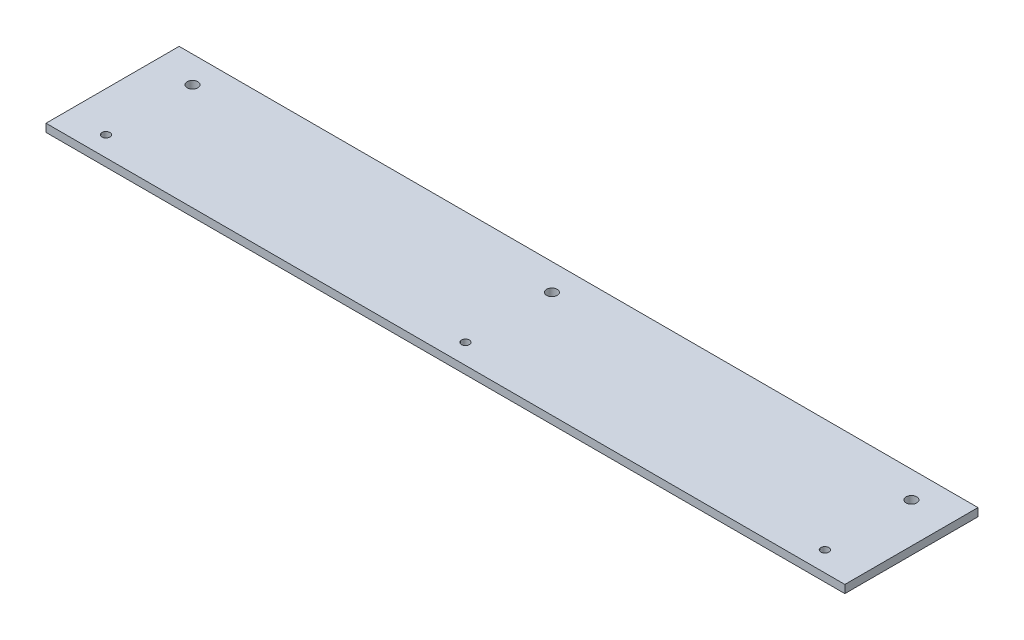
ISO-10303-21;
HEADER;
FILE_DESCRIPTION(('STEP AP214'),'2;1');
FILE_NAME('part.step','',(''),(''),'','','');
FILE_SCHEMA(('AUTOMOTIVE_DESIGN { 1 0 10303 214 1 1 1 1 }'));
ENDSEC;
DATA;
#1=APPLICATION_CONTEXT('core data for automotive mechanical design processes');
#2=APPLICATION_PROTOCOL_DEFINITION('international standard','automotive_design',2000,#1);
#3=PRODUCT_CONTEXT('',#1,'mechanical');
#4=PRODUCT('Part','Part','',(#3));
#5=PRODUCT_RELATED_PRODUCT_CATEGORY('part','',(#4));
#6=PRODUCT_DEFINITION_FORMATION('','',#4);
#7=PRODUCT_DEFINITION_CONTEXT('part definition',#1,'design');
#8=PRODUCT_DEFINITION('design','',#6,#7);
#9=PRODUCT_DEFINITION_SHAPE('','',#8);
#10=(LENGTH_UNIT() NAMED_UNIT(*) SI_UNIT(.MILLI.,.METRE.));
#11=(NAMED_UNIT(*) PLANE_ANGLE_UNIT() SI_UNIT($,.RADIAN.));
#12=(NAMED_UNIT(*) SI_UNIT($,.STERADIAN.) SOLID_ANGLE_UNIT());
#13=UNCERTAINTY_MEASURE_WITH_UNIT(LENGTH_MEASURE(1.E-05),#10,'distance_accuracy_value','');
#14=(GEOMETRIC_REPRESENTATION_CONTEXT(3) GLOBAL_UNCERTAINTY_ASSIGNED_CONTEXT((#13)) GLOBAL_UNIT_ASSIGNED_CONTEXT((#10,
#11,#12)) REPRESENTATION_CONTEXT('',''));
#15=CARTESIAN_POINT('',(0.,0.,0.));
#16=DIRECTION('',(0.,0.,1.));
#17=DIRECTION('',(1.,0.,0.));
#18=AXIS2_PLACEMENT_3D('',#15,#16,#17);
#19=CARTESIAN_POINT('',(0.,3.,0.));
#20=DIRECTION('',(0.,-1.,0.));
#21=DIRECTION('',(0.,0.,-1.));
#22=AXIS2_PLACEMENT_3D('',#19,#20,#21);
#23=PLANE('',#22);
#24=DIRECTION('',(0.,0.,1.));
#25=VECTOR('',#24,1.);
#26=CARTESIAN_POINT('',(0.,3.,0.));
#27=LINE('',#26,#25);
#28=CARTESIAN_POINT('',(0.,3.,-50.));
#29=VERTEX_POINT('',#28);
#30=CARTESIAN_POINT('',(0.,3.,0.));
#31=VERTEX_POINT('',#30);
#32=EDGE_CURVE('E96',#29,#31,#27,.T.);
#33=ORIENTED_EDGE('',*,*,#32,.T.);
#34=DIRECTION('',(1.,0.,0.));
#35=VECTOR('',#34,1.);
#36=CARTESIAN_POINT('',(0.,3.,0.));
#37=LINE('',#36,#35);
#38=CARTESIAN_POINT('',(300.,3.,0.));
#39=VERTEX_POINT('',#38);
#40=EDGE_CURVE('E91',#31,#39,#37,.T.);
#41=ORIENTED_EDGE('',*,*,#40,.T.);
#42=DIRECTION('',(0.,0.,-1.));
#43=VECTOR('',#42,1.);
#44=CARTESIAN_POINT('',(300.,3.,0.));
#45=LINE('',#44,#43);
#46=CARTESIAN_POINT('',(300.,3.,-50.));
#47=VERTEX_POINT('',#46);
#48=EDGE_CURVE('E94',#39,#47,#45,.T.);
#49=ORIENTED_EDGE('',*,*,#48,.T.);
#50=DIRECTION('',(-1.,0.,0.));
#51=VECTOR('',#50,1.);
#52=CARTESIAN_POINT('',(0.,3.,-50.));
#53=LINE('',#52,#51);
#54=EDGE_CURVE('E61',#47,#29,#53,.T.);
#55=ORIENTED_EDGE('',*,*,#54,.T.);
#56=EDGE_LOOP('',(#33,#41,#49,#55));
#57=FACE_BOUND('',#56,.T.);
#58=CARTESIAN_POINT('',(15.,3.,-40.));
#59=DIRECTION('',(0.,1.,0.));
#60=DIRECTION('',(0.,0.,1.));
#61=AXIS2_PLACEMENT_3D('',#58,#59,#60);
#62=CIRCLE('',#61,2.);
#63=CARTESIAN_POINT('',(15.,3.,-38.));
#64=VERTEX_POINT('',#63);
#65=EDGE_CURVE('E116',#64,#64,#62,.T.);
#66=ORIENTED_EDGE('',*,*,#65,.F.);
#67=EDGE_LOOP('',(#66));
#68=FACE_BOUND('',#67,.T.);
#69=CARTESIAN_POINT('',(150.,3.,-40.));
#70=DIRECTION('',(0.,1.,0.));
#71=DIRECTION('',(0.,0.,1.));
#72=AXIS2_PLACEMENT_3D('',#69,#70,#71);
#73=CIRCLE('',#72,2.);
#74=CARTESIAN_POINT('',(150.,3.,-38.));
#75=VERTEX_POINT('',#74);
#76=EDGE_CURVE('E138',#75,#75,#73,.T.);
#77=ORIENTED_EDGE('',*,*,#76,.F.);
#78=EDGE_LOOP('',(#77));
#79=FACE_BOUND('',#78,.T.);
#80=CARTESIAN_POINT('',(285.,3.,-40.));
#81=DIRECTION('',(0.,1.,0.));
#82=DIRECTION('',(0.,0.,1.));
#83=AXIS2_PLACEMENT_3D('',#80,#81,#82);
#84=CIRCLE('',#83,2.);
#85=CARTESIAN_POINT('',(285.,3.,-38.));
#86=VERTEX_POINT('',#85);
#87=EDGE_CURVE('E146',#86,#86,#84,.T.);
#88=ORIENTED_EDGE('',*,*,#87,.F.);
#89=EDGE_LOOP('',(#88));
#90=FACE_BOUND('',#89,.T.);
#91=CARTESIAN_POINT('',(15.,3.,-7.5));
#92=DIRECTION('',(0.,1.,0.));
#93=DIRECTION('',(0.,0.,1.));
#94=AXIS2_PLACEMENT_3D('',#91,#92,#93);
#95=CIRCLE('',#94,1.5);
#96=CARTESIAN_POINT('',(15.,3.,-6.));
#97=VERTEX_POINT('',#96);
#98=EDGE_CURVE('E154',#97,#97,#95,.T.);
#99=ORIENTED_EDGE('',*,*,#98,.F.);
#100=EDGE_LOOP('',(#99));
#101=FACE_BOUND('',#100,.T.);
#102=CARTESIAN_POINT('',(285.,3.,-7.5));
#103=DIRECTION('',(0.,1.,0.));
#104=DIRECTION('',(0.,0.,1.));
#105=AXIS2_PLACEMENT_3D('',#102,#103,#104);
#106=CIRCLE('',#105,1.50000000000002);
#107=CARTESIAN_POINT('',(285.,3.,-5.99999999999998));
#108=VERTEX_POINT('',#107);
#109=EDGE_CURVE('E162',#108,#108,#106,.T.);
#110=ORIENTED_EDGE('',*,*,#109,.F.);
#111=EDGE_LOOP('',(#110));
#112=FACE_BOUND('',#111,.T.);
#113=CARTESIAN_POINT('',(150.,3.,-7.5));
#114=DIRECTION('',(0.,1.,0.));
#115=DIRECTION('',(0.,0.,1.));
#116=AXIS2_PLACEMENT_3D('',#113,#114,#115);
#117=CIRCLE('',#116,1.5);
#118=CARTESIAN_POINT('',(150.,3.,-6.));
#119=VERTEX_POINT('',#118);
#120=EDGE_CURVE('E170',#119,#119,#117,.T.);
#121=ORIENTED_EDGE('',*,*,#120,.F.);
#122=EDGE_LOOP('',(#121));
#123=FACE_BOUND('',#122,.T.);
#124=ADVANCED_FACE('F43',(#57,#68,#79,#90,#101,#112,#123),#23,.F.);
#125=CARTESIAN_POINT('',(0.,0.,0.));
#126=DIRECTION('',(0.,-1.,0.));
#127=DIRECTION('',(0.,0.,-1.));
#128=AXIS2_PLACEMENT_3D('',#125,#126,#127);
#129=PLANE('',#128);
#130=CARTESIAN_POINT('',(285.,0.,-7.5));
#131=DIRECTION('',(0.,1.,0.));
#132=DIRECTION('',(0.,0.,1.));
#133=AXIS2_PLACEMENT_3D('',#130,#131,#132);
#134=CIRCLE('',#133,1.50000000000002);
#135=CARTESIAN_POINT('',(285.,0.,-5.99999999999998));
#136=VERTEX_POINT('',#135);
#137=EDGE_CURVE('E166',#136,#136,#134,.T.);
#138=ORIENTED_EDGE('',*,*,#137,.T.);
#139=EDGE_LOOP('',(#138));
#140=FACE_BOUND('',#139,.T.);
#141=CARTESIAN_POINT('',(285.,0.,-40.));
#142=DIRECTION('',(0.,1.,0.));
#143=DIRECTION('',(0.,0.,1.));
#144=AXIS2_PLACEMENT_3D('',#141,#142,#143);
#145=CIRCLE('',#144,2.);
#146=CARTESIAN_POINT('',(285.,0.,-38.));
#147=VERTEX_POINT('',#146);
#148=EDGE_CURVE('E150',#147,#147,#145,.T.);
#149=ORIENTED_EDGE('',*,*,#148,.T.);
#150=EDGE_LOOP('',(#149));
#151=FACE_BOUND('',#150,.T.);
#152=CARTESIAN_POINT('',(15.,0.,-40.));
#153=DIRECTION('',(0.,1.,0.));
#154=DIRECTION('',(0.,0.,1.));
#155=AXIS2_PLACEMENT_3D('',#152,#153,#154);
#156=CIRCLE('',#155,2.);
#157=CARTESIAN_POINT('',(15.,0.,-38.));
#158=VERTEX_POINT('',#157);
#159=EDGE_CURVE('E134',#158,#158,#156,.T.);
#160=ORIENTED_EDGE('',*,*,#159,.T.);
#161=EDGE_LOOP('',(#160));
#162=FACE_BOUND('',#161,.T.);
#163=DIRECTION('',(0.,0.,1.));
#164=VECTOR('',#163,1.);
#165=CARTESIAN_POINT('',(0.,0.,0.));
#166=LINE('',#165,#164);
#167=CARTESIAN_POINT('',(0.,0.,-50.));
#168=VERTEX_POINT('',#167);
#169=CARTESIAN_POINT('',(0.,0.,0.));
#170=VERTEX_POINT('',#169);
#171=EDGE_CURVE('E112',#168,#170,#166,.T.);
#172=ORIENTED_EDGE('',*,*,#171,.F.);
#173=DIRECTION('',(-1.,0.,0.));
#174=VECTOR('',#173,1.);
#175=CARTESIAN_POINT('',(0.,0.,-50.));
#176=LINE('',#175,#174);
#177=CARTESIAN_POINT('',(300.,0.,-50.));
#178=VERTEX_POINT('',#177);
#179=EDGE_CURVE('E84',#178,#168,#176,.T.);
#180=ORIENTED_EDGE('',*,*,#179,.F.);
#181=DIRECTION('',(0.,0.,-1.));
#182=VECTOR('',#181,1.);
#183=CARTESIAN_POINT('',(300.,0.,0.));
#184=LINE('',#183,#182);
#185=CARTESIAN_POINT('',(300.,0.,0.));
#186=VERTEX_POINT('',#185);
#187=EDGE_CURVE('E78',#186,#178,#184,.T.);
#188=ORIENTED_EDGE('',*,*,#187,.F.);
#189=DIRECTION('',(1.,0.,0.));
#190=VECTOR('',#189,1.);
#191=CARTESIAN_POINT('',(0.,0.,0.));
#192=LINE('',#191,#190);
#193=EDGE_CURVE('E101',#170,#186,#192,.T.);
#194=ORIENTED_EDGE('',*,*,#193,.F.);
#195=EDGE_LOOP('',(#172,#180,#188,#194));
#196=FACE_BOUND('',#195,.T.);
#197=CARTESIAN_POINT('',(150.,0.,-40.));
#198=DIRECTION('',(0.,1.,0.));
#199=DIRECTION('',(0.,0.,1.));
#200=AXIS2_PLACEMENT_3D('',#197,#198,#199);
#201=CIRCLE('',#200,2.);
#202=CARTESIAN_POINT('',(150.,0.,-38.));
#203=VERTEX_POINT('',#202);
#204=EDGE_CURVE('E142',#203,#203,#201,.T.);
#205=ORIENTED_EDGE('',*,*,#204,.T.);
#206=EDGE_LOOP('',(#205));
#207=FACE_BOUND('',#206,.T.);
#208=CARTESIAN_POINT('',(15.,0.,-7.5));
#209=DIRECTION('',(0.,1.,0.));
#210=DIRECTION('',(0.,0.,1.));
#211=AXIS2_PLACEMENT_3D('',#208,#209,#210);
#212=CIRCLE('',#211,1.5);
#213=CARTESIAN_POINT('',(15.,0.,-6.));
#214=VERTEX_POINT('',#213);
#215=EDGE_CURVE('E158',#214,#214,#212,.T.);
#216=ORIENTED_EDGE('',*,*,#215,.T.);
#217=EDGE_LOOP('',(#216));
#218=FACE_BOUND('',#217,.T.);
#219=CARTESIAN_POINT('',(150.,0.,-7.5));
#220=DIRECTION('',(0.,1.,0.));
#221=DIRECTION('',(0.,0.,1.));
#222=AXIS2_PLACEMENT_3D('',#219,#220,#221);
#223=CIRCLE('',#222,1.5);
#224=CARTESIAN_POINT('',(150.,0.,-6.));
#225=VERTEX_POINT('',#224);
#226=EDGE_CURVE('E174',#225,#225,#223,.T.);
#227=ORIENTED_EDGE('',*,*,#226,.T.);
#228=EDGE_LOOP('',(#227));
#229=FACE_BOUND('',#228,.T.);
#230=ADVANCED_FACE('F129',(#140,#151,#162,#196,#207,#218,#229),#129,.T.);
#231=CARTESIAN_POINT('',(0.,3.,0.));
#232=DIRECTION('',(1.,0.,0.));
#233=DIRECTION('',(0.,0.,-1.));
#234=AXIS2_PLACEMENT_3D('',#231,#232,#233);
#235=PLANE('',#234);
#236=ORIENTED_EDGE('',*,*,#171,.T.);
#237=DIRECTION('',(0.,-1.,0.));
#238=VECTOR('',#237,1.);
#239=CARTESIAN_POINT('',(0.,3.,0.));
#240=LINE('',#239,#238);
#241=EDGE_CURVE('E11',#31,#170,#240,.T.);
#242=ORIENTED_EDGE('',*,*,#241,.F.);
#243=ORIENTED_EDGE('',*,*,#32,.F.);
#244=DIRECTION('',(0.,-1.,0.));
#245=VECTOR('',#244,1.);
#246=CARTESIAN_POINT('',(0.,3.,-50.));
#247=LINE('',#246,#245);
#248=EDGE_CURVE('E108',#29,#168,#247,.T.);
#249=ORIENTED_EDGE('',*,*,#248,.T.);
#250=EDGE_LOOP('',(#236,#242,#243,#249));
#251=FACE_BOUND('',#250,.T.);
#252=ADVANCED_FACE('F45',(#251),#235,.F.);
#253=CARTESIAN_POINT('',(0.,3.,0.));
#254=DIRECTION('',(0.,0.,-1.));
#255=DIRECTION('',(-1.,0.,0.));
#256=AXIS2_PLACEMENT_3D('',#253,#254,#255);
#257=PLANE('',#256);
#258=ORIENTED_EDGE('',*,*,#193,.T.);
#259=DIRECTION('',(0.,-1.,0.));
#260=VECTOR('',#259,1.);
#261=CARTESIAN_POINT('',(300.,3.,0.));
#262=LINE('',#261,#260);
#263=EDGE_CURVE('E53',#39,#186,#262,.T.);
#264=ORIENTED_EDGE('',*,*,#263,.F.);
#265=ORIENTED_EDGE('',*,*,#40,.F.);
#266=ORIENTED_EDGE('',*,*,#241,.T.);
#267=EDGE_LOOP('',(#258,#264,#265,#266));
#268=FACE_BOUND('',#267,.T.);
#269=ADVANCED_FACE('F100',(#268),#257,.F.);
#270=CARTESIAN_POINT('',(300.,3.,0.));
#271=DIRECTION('',(-1.,0.,0.));
#272=DIRECTION('',(0.,0.,1.));
#273=AXIS2_PLACEMENT_3D('',#270,#271,#272);
#274=PLANE('',#273);
#275=ORIENTED_EDGE('',*,*,#187,.T.);
#276=DIRECTION('',(0.,-1.,0.));
#277=VECTOR('',#276,1.);
#278=CARTESIAN_POINT('',(300.,3.,-50.));
#279=LINE('',#278,#277);
#280=EDGE_CURVE('E103',#47,#178,#279,.T.);
#281=ORIENTED_EDGE('',*,*,#280,.F.);
#282=ORIENTED_EDGE('',*,*,#48,.F.);
#283=ORIENTED_EDGE('',*,*,#263,.T.);
#284=EDGE_LOOP('',(#275,#281,#282,#283));
#285=FACE_BOUND('',#284,.T.);
#286=ADVANCED_FACE('F104',(#285),#274,.F.);
#287=CARTESIAN_POINT('',(0.,3.,-50.));
#288=DIRECTION('',(0.,0.,1.));
#289=DIRECTION('',(1.,0.,0.));
#290=AXIS2_PLACEMENT_3D('',#287,#288,#289);
#291=PLANE('',#290);
#292=ORIENTED_EDGE('',*,*,#179,.T.);
#293=ORIENTED_EDGE('',*,*,#248,.F.);
#294=ORIENTED_EDGE('',*,*,#54,.F.);
#295=ORIENTED_EDGE('',*,*,#280,.T.);
#296=EDGE_LOOP('',(#292,#293,#294,#295));
#297=FACE_BOUND('',#296,.T.);
#298=ADVANCED_FACE('F126',(#297),#291,.F.);
#299=CARTESIAN_POINT('',(15.,3.,-40.));
#300=DIRECTION('',(0.,-1.,0.));
#301=DIRECTION('',(0.,0.,-1.));
#302=AXIS2_PLACEMENT_3D('',#299,#300,#301);
#303=CYLINDRICAL_SURFACE('',#302,2.);
#304=ORIENTED_EDGE('',*,*,#65,.T.);
#305=EDGE_LOOP('',(#304));
#306=FACE_BOUND('',#305,.T.);
#307=ORIENTED_EDGE('',*,*,#159,.F.);
#308=EDGE_LOOP('',(#307));
#309=FACE_BOUND('',#308,.T.);
#310=ADVANCED_FACE('F193',(#306,#309),#303,.F.);
#311=CARTESIAN_POINT('',(150.,3.,-40.));
#312=DIRECTION('',(0.,-1.,0.));
#313=DIRECTION('',(0.,0.,-1.));
#314=AXIS2_PLACEMENT_3D('',#311,#312,#313);
#315=CYLINDRICAL_SURFACE('',#314,2.);
#316=ORIENTED_EDGE('',*,*,#76,.T.);
#317=EDGE_LOOP('',(#316));
#318=FACE_BOUND('',#317,.T.);
#319=ORIENTED_EDGE('',*,*,#204,.F.);
#320=EDGE_LOOP('',(#319));
#321=FACE_BOUND('',#320,.T.);
#322=ADVANCED_FACE('F247',(#318,#321),#315,.F.);
#323=CARTESIAN_POINT('',(285.,3.,-40.));
#324=DIRECTION('',(0.,-1.,0.));
#325=DIRECTION('',(0.,0.,-1.));
#326=AXIS2_PLACEMENT_3D('',#323,#324,#325);
#327=CYLINDRICAL_SURFACE('',#326,2.);
#328=ORIENTED_EDGE('',*,*,#87,.T.);
#329=EDGE_LOOP('',(#328));
#330=FACE_BOUND('',#329,.T.);
#331=ORIENTED_EDGE('',*,*,#148,.F.);
#332=EDGE_LOOP('',(#331));
#333=FACE_BOUND('',#332,.T.);
#334=ADVANCED_FACE('F256',(#330,#333),#327,.F.);
#335=CARTESIAN_POINT('',(15.,3.,-7.5));
#336=DIRECTION('',(0.,-1.,0.));
#337=DIRECTION('',(0.,0.,-1.));
#338=AXIS2_PLACEMENT_3D('',#335,#336,#337);
#339=CYLINDRICAL_SURFACE('',#338,1.5);
#340=ORIENTED_EDGE('',*,*,#98,.T.);
#341=EDGE_LOOP('',(#340));
#342=FACE_BOUND('',#341,.T.);
#343=ORIENTED_EDGE('',*,*,#215,.F.);
#344=EDGE_LOOP('',(#343));
#345=FACE_BOUND('',#344,.T.);
#346=ADVANCED_FACE('F265',(#342,#345),#339,.F.);
#347=CARTESIAN_POINT('',(285.,3.,-7.5));
#348=DIRECTION('',(0.,-1.,0.));
#349=DIRECTION('',(0.,0.,-1.));
#350=AXIS2_PLACEMENT_3D('',#347,#348,#349);
#351=CYLINDRICAL_SURFACE('',#350,1.50000000000002);
#352=ORIENTED_EDGE('',*,*,#109,.T.);
#353=EDGE_LOOP('',(#352));
#354=FACE_BOUND('',#353,.T.);
#355=ORIENTED_EDGE('',*,*,#137,.F.);
#356=EDGE_LOOP('',(#355));
#357=FACE_BOUND('',#356,.T.);
#358=ADVANCED_FACE('F275',(#354,#357),#351,.F.);
#359=CARTESIAN_POINT('',(150.,3.,-7.5));
#360=DIRECTION('',(0.,-1.,0.));
#361=DIRECTION('',(0.,0.,-1.));
#362=AXIS2_PLACEMENT_3D('',#359,#360,#361);
#363=CYLINDRICAL_SURFACE('',#362,1.5);
#364=ORIENTED_EDGE('',*,*,#120,.T.);
#365=EDGE_LOOP('',(#364));
#366=FACE_BOUND('',#365,.T.);
#367=ORIENTED_EDGE('',*,*,#226,.F.);
#368=EDGE_LOOP('',(#367));
#369=FACE_BOUND('',#368,.T.);
#370=ADVANCED_FACE('F182',(#366,#369),#363,.F.);
#371=CLOSED_SHELL('',(#124,#230,#252,#269,#286,#298,#310,#322,#334,#346,#358,#370));
#372=MANIFOLD_SOLID_BREP('B2',#371);
#373=ADVANCED_BREP_SHAPE_REPRESENTATION('',(#18,#372),#14);
#374=SHAPE_DEFINITION_REPRESENTATION(#9,#373);
ENDSEC;
END-ISO-10303-21;
